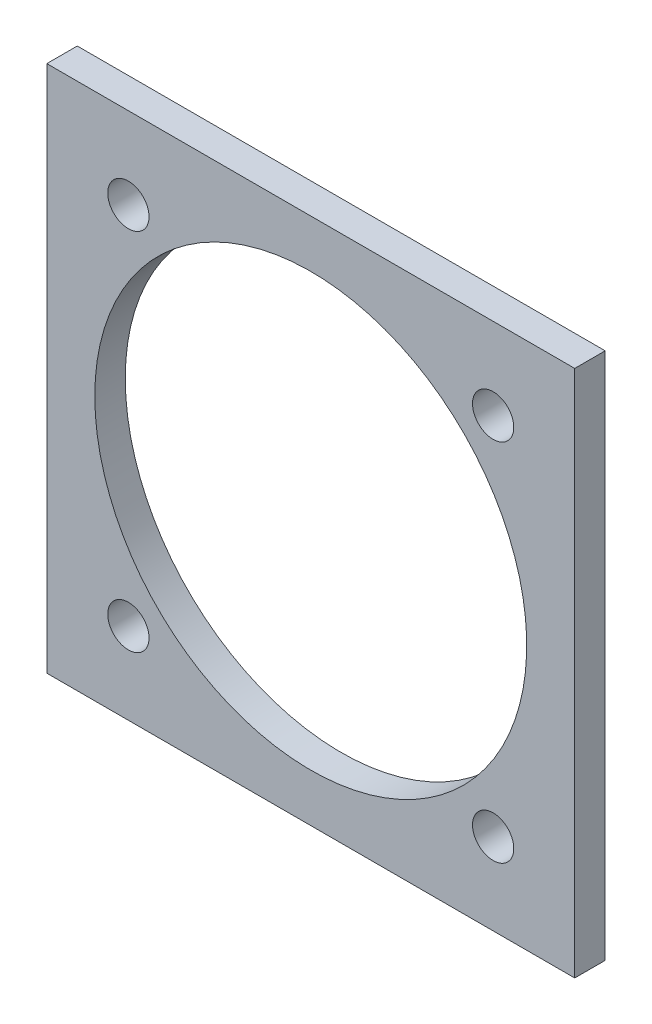
ISO-10303-21;
HEADER;
FILE_DESCRIPTION(('STEP AP214'),'2;1');
FILE_NAME('part.step','',(''),(''),'','','');
FILE_SCHEMA(('AUTOMOTIVE_DESIGN { 1 0 10303 214 1 1 1 1 }'));
ENDSEC;
DATA;
#1=APPLICATION_CONTEXT('core data for automotive mechanical design processes');
#2=APPLICATION_PROTOCOL_DEFINITION('international standard','automotive_design',2000,#1);
#3=PRODUCT_CONTEXT('',#1,'mechanical');
#4=PRODUCT('Part','Part','',(#3));
#5=PRODUCT_RELATED_PRODUCT_CATEGORY('part','',(#4));
#6=PRODUCT_DEFINITION_FORMATION('','',#4);
#7=PRODUCT_DEFINITION_CONTEXT('part definition',#1,'design');
#8=PRODUCT_DEFINITION('design','',#6,#7);
#9=PRODUCT_DEFINITION_SHAPE('','',#8);
#10=(LENGTH_UNIT() NAMED_UNIT(*) SI_UNIT(.MILLI.,.METRE.));
#11=(NAMED_UNIT(*) PLANE_ANGLE_UNIT() SI_UNIT($,.RADIAN.));
#12=(NAMED_UNIT(*) SI_UNIT($,.STERADIAN.) SOLID_ANGLE_UNIT());
#13=UNCERTAINTY_MEASURE_WITH_UNIT(LENGTH_MEASURE(1.E-05),#10,'distance_accuracy_value','');
#14=(GEOMETRIC_REPRESENTATION_CONTEXT(3) GLOBAL_UNCERTAINTY_ASSIGNED_CONTEXT((#13)) GLOBAL_UNIT_ASSIGNED_CONTEXT((#10,
#11,#12)) REPRESENTATION_CONTEXT('',''));
#15=CARTESIAN_POINT('',(0.,0.,0.));
#16=DIRECTION('',(0.,0.,1.));
#17=DIRECTION('',(1.,0.,0.));
#18=AXIS2_PLACEMENT_3D('',#15,#16,#17);
#19=CARTESIAN_POINT('',(-27.5,27.5,3.17500000000001));
#20=DIRECTION('',(0.,0.,0.99999999999999));
#21=DIRECTION('',(1.,0.,0.));
#22=AXIS2_PLACEMENT_3D('',#19,#20,#21);
#23=PLANE('',#22);
#24=CARTESIAN_POINT('',(-19.,-19.,3.17500000000001));
#25=DIRECTION('',(0.,0.,0.99999999999999));
#26=DIRECTION('',(1.,0.,0.));
#27=AXIS2_PLACEMENT_3D('',#24,#25,#26);
#28=CIRCLE('',#27,2.15);
#29=CARTESIAN_POINT('',(-21.15,-19.,3.17500000000001));
#30=VERTEX_POINT('',#29);
#31=EDGE_CURVE('E126',#30,#30,#28,.T.);
#32=ORIENTED_EDGE('',*,*,#31,.F.);
#33=EDGE_LOOP('',(#32));
#34=FACE_BOUND('',#33,.T.);
#35=CARTESIAN_POINT('',(19.0000000000006,19.,3.17500000000001));
#36=DIRECTION('',(0.,0.,0.99999999999999));
#37=DIRECTION('',(1.,0.,0.));
#38=AXIS2_PLACEMENT_3D('',#35,#36,#37);
#39=CIRCLE('',#38,2.15);
#40=CARTESIAN_POINT('',(16.8500000000006,19.,3.17500000000001));
#41=VERTEX_POINT('',#40);
#42=EDGE_CURVE('E114',#41,#41,#39,.T.);
#43=ORIENTED_EDGE('',*,*,#42,.F.);
#44=EDGE_LOOP('',(#43));
#45=FACE_BOUND('',#44,.T.);
#46=DIRECTION('',(0.,-1.,0.));
#47=VECTOR('',#46,1.);
#48=CARTESIAN_POINT('',(-27.5,-27.5,3.17500000000001));
#49=LINE('',#48,#47);
#50=CARTESIAN_POINT('',(-27.5,27.5,3.17500000000001));
#51=VERTEX_POINT('',#50);
#52=CARTESIAN_POINT('',(-27.5,-27.5,3.17500000000001));
#53=VERTEX_POINT('',#52);
#54=EDGE_CURVE('E84',#51,#53,#49,.T.);
#55=ORIENTED_EDGE('',*,*,#54,.T.);
#56=DIRECTION('',(1.,0.,0.));
#57=VECTOR('',#56,1.);
#58=CARTESIAN_POINT('',(27.5,-27.5,3.17500000000001));
#59=LINE('',#58,#57);
#60=CARTESIAN_POINT('',(27.5,-27.5,3.17500000000001));
#61=VERTEX_POINT('',#60);
#62=EDGE_CURVE('E79',#53,#61,#59,.T.);
#63=ORIENTED_EDGE('',*,*,#62,.T.);
#64=DIRECTION('',(0.,1.,0.));
#65=VECTOR('',#64,1.);
#66=CARTESIAN_POINT('',(27.5,-27.5,3.17500000000001));
#67=LINE('',#66,#65);
#68=CARTESIAN_POINT('',(27.5000000000006,27.5,3.17500000000001));
#69=VERTEX_POINT('',#68);
#70=EDGE_CURVE('E82',#61,#69,#67,.T.);
#71=ORIENTED_EDGE('',*,*,#70,.T.);
#72=DIRECTION('',(-1.,0.,0.));
#73=VECTOR('',#72,1.);
#74=CARTESIAN_POINT('',(27.5000000000006,27.5,3.17500000000001));
#75=LINE('',#74,#73);
#76=EDGE_CURVE('E49',#69,#51,#75,.T.);
#77=ORIENTED_EDGE('',*,*,#76,.T.);
#78=EDGE_LOOP('',(#55,#63,#71,#77));
#79=FACE_BOUND('',#78,.T.);
#80=CARTESIAN_POINT('',(0.,0.,3.17500000000001));
#81=DIRECTION('',(0.,0.,0.99999999999999));
#82=DIRECTION('',(1.,0.,0.));
#83=AXIS2_PLACEMENT_3D('',#80,#81,#82);
#84=CIRCLE('',#83,22.5);
#85=CARTESIAN_POINT('',(-22.5,0.,3.17500000000001));
#86=VERTEX_POINT('',#85);
#87=EDGE_CURVE('E99',#86,#86,#84,.T.);
#88=ORIENTED_EDGE('',*,*,#87,.F.);
#89=EDGE_LOOP('',(#88));
#90=FACE_BOUND('',#89,.T.);
#91=CARTESIAN_POINT('',(19.0000000000006,-19.,3.17500000000001));
#92=DIRECTION('',(0.,0.,0.99999999999999));
#93=DIRECTION('',(-1.,0.,0.));
#94=AXIS2_PLACEMENT_3D('',#91,#92,#93);
#95=CIRCLE('',#94,2.15);
#96=CARTESIAN_POINT('',(16.8500000000006,-19.,3.17500000000001));
#97=VERTEX_POINT('',#96);
#98=EDGE_CURVE('E120',#97,#97,#95,.T.);
#99=ORIENTED_EDGE('',*,*,#98,.F.);
#100=EDGE_LOOP('',(#99));
#101=FACE_BOUND('',#100,.T.);
#102=CARTESIAN_POINT('',(-19.,19.,3.17500000000001));
#103=DIRECTION('',(0.,0.,0.99999999999999));
#104=DIRECTION('',(-1.,0.,0.));
#105=AXIS2_PLACEMENT_3D('',#102,#103,#104);
#106=CIRCLE('',#105,2.15);
#107=CARTESIAN_POINT('',(-21.15,19.,3.17500000000001));
#108=VERTEX_POINT('',#107);
#109=EDGE_CURVE('E132',#108,#108,#106,.T.);
#110=ORIENTED_EDGE('',*,*,#109,.F.);
#111=EDGE_LOOP('',(#110));
#112=FACE_BOUND('',#111,.T.);
#113=ADVANCED_FACE('F32',(#34,#45,#79,#90,#101,#112),#23,.T.);
#114=CARTESIAN_POINT('',(-27.5,27.5,0.));
#115=DIRECTION('',(0.,0.,0.99999999999999));
#116=DIRECTION('',(1.,0.,0.));
#117=AXIS2_PLACEMENT_3D('',#114,#115,#116);
#118=PLANE('',#117);
#119=CARTESIAN_POINT('',(-19.,-19.,0.));
#120=DIRECTION('',(0.,0.,0.99999999999999));
#121=DIRECTION('',(1.,0.,0.));
#122=AXIS2_PLACEMENT_3D('',#119,#120,#121);
#123=CIRCLE('',#122,2.15);
#124=CARTESIAN_POINT('',(-21.15,-19.,0.));
#125=VERTEX_POINT('',#124);
#126=EDGE_CURVE('E129',#125,#125,#123,.T.);
#127=ORIENTED_EDGE('',*,*,#126,.T.);
#128=EDGE_LOOP('',(#127));
#129=FACE_BOUND('',#128,.T.);
#130=CARTESIAN_POINT('',(19.0000000000006,19.,0.));
#131=DIRECTION('',(0.,0.,0.99999999999999));
#132=DIRECTION('',(1.,0.,0.));
#133=AXIS2_PLACEMENT_3D('',#130,#131,#132);
#134=CIRCLE('',#133,2.15);
#135=CARTESIAN_POINT('',(16.8500000000006,19.,0.));
#136=VERTEX_POINT('',#135);
#137=EDGE_CURVE('E117',#136,#136,#134,.T.);
#138=ORIENTED_EDGE('',*,*,#137,.T.);
#139=EDGE_LOOP('',(#138));
#140=FACE_BOUND('',#139,.T.);
#141=DIRECTION('',(0.,-1.,0.));
#142=VECTOR('',#141,1.);
#143=CARTESIAN_POINT('',(-27.5,-27.5,0.));
#144=LINE('',#143,#142);
#145=CARTESIAN_POINT('',(-27.5,27.5,0.));
#146=VERTEX_POINT('',#145);
#147=CARTESIAN_POINT('',(-27.5,-27.5,0.));
#148=VERTEX_POINT('',#147);
#149=EDGE_CURVE('E96',#146,#148,#144,.T.);
#150=ORIENTED_EDGE('',*,*,#149,.F.);
#151=DIRECTION('',(-1.,0.,0.));
#152=VECTOR('',#151,1.);
#153=CARTESIAN_POINT('',(27.5000000000006,27.5,0.));
#154=LINE('',#153,#152);
#155=CARTESIAN_POINT('',(27.5000000000006,27.5,0.));
#156=VERTEX_POINT('',#155);
#157=EDGE_CURVE('E72',#156,#146,#154,.T.);
#158=ORIENTED_EDGE('',*,*,#157,.F.);
#159=DIRECTION('',(0.,1.,0.));
#160=VECTOR('',#159,1.);
#161=CARTESIAN_POINT('',(27.5,-27.5,0.));
#162=LINE('',#161,#160);
#163=CARTESIAN_POINT('',(27.5,-27.5,0.));
#164=VERTEX_POINT('',#163);
#165=EDGE_CURVE('E66',#164,#156,#162,.T.);
#166=ORIENTED_EDGE('',*,*,#165,.F.);
#167=DIRECTION('',(1.,0.,0.));
#168=VECTOR('',#167,1.);
#169=CARTESIAN_POINT('',(27.5,-27.5,0.));
#170=LINE('',#169,#168);
#171=EDGE_CURVE('E88',#148,#164,#170,.T.);
#172=ORIENTED_EDGE('',*,*,#171,.F.);
#173=EDGE_LOOP('',(#150,#158,#166,#172));
#174=FACE_BOUND('',#173,.T.);
#175=CARTESIAN_POINT('',(0.,0.,0.));
#176=DIRECTION('',(0.,0.,0.99999999999999));
#177=DIRECTION('',(1.,0.,0.));
#178=AXIS2_PLACEMENT_3D('',#175,#176,#177);
#179=CIRCLE('',#178,22.5);
#180=CARTESIAN_POINT('',(-22.5,0.,0.));
#181=VERTEX_POINT('',#180);
#182=EDGE_CURVE('E111',#181,#181,#179,.T.);
#183=ORIENTED_EDGE('',*,*,#182,.T.);
#184=EDGE_LOOP('',(#183));
#185=FACE_BOUND('',#184,.T.);
#186=CARTESIAN_POINT('',(19.0000000000006,-19.,0.));
#187=DIRECTION('',(0.,0.,0.99999999999999));
#188=DIRECTION('',(-1.,0.,0.));
#189=AXIS2_PLACEMENT_3D('',#186,#187,#188);
#190=CIRCLE('',#189,2.15);
#191=CARTESIAN_POINT('',(16.8500000000006,-19.,0.));
#192=VERTEX_POINT('',#191);
#193=EDGE_CURVE('E123',#192,#192,#190,.T.);
#194=ORIENTED_EDGE('',*,*,#193,.T.);
#195=EDGE_LOOP('',(#194));
#196=FACE_BOUND('',#195,.T.);
#197=CARTESIAN_POINT('',(-19.,19.,0.));
#198=DIRECTION('',(0.,0.,0.99999999999999));
#199=DIRECTION('',(-1.,0.,0.));
#200=AXIS2_PLACEMENT_3D('',#197,#198,#199);
#201=CIRCLE('',#200,2.15);
#202=CARTESIAN_POINT('',(-21.15,19.,0.));
#203=VERTEX_POINT('',#202);
#204=EDGE_CURVE('E135',#203,#203,#201,.T.);
#205=ORIENTED_EDGE('',*,*,#204,.T.);
#206=EDGE_LOOP('',(#205));
#207=FACE_BOUND('',#206,.T.);
#208=ADVANCED_FACE('F107',(#129,#140,#174,#185,#196,#207),#118,.F.);
#209=CARTESIAN_POINT('',(-27.5,-27.5,3.17500000000001));
#210=DIRECTION('',(1.,0.,0.));
#211=DIRECTION('',(0.,0.,-0.99999999999999));
#212=AXIS2_PLACEMENT_3D('',#209,#210,#211);
#213=PLANE('',#212);
#214=ORIENTED_EDGE('',*,*,#149,.T.);
#215=DIRECTION('',(0.,0.,-0.99999999999999));
#216=VECTOR('',#215,1.);
#217=CARTESIAN_POINT('',(-27.5,-27.5,3.17500000000001));
#218=LINE('',#217,#216);
#219=EDGE_CURVE('E11',#53,#148,#218,.T.);
#220=ORIENTED_EDGE('',*,*,#219,.F.);
#221=ORIENTED_EDGE('',*,*,#54,.F.);
#222=DIRECTION('',(0.,0.,-0.99999999999999));
#223=VECTOR('',#222,1.);
#224=CARTESIAN_POINT('',(-27.5,27.5,3.17500000000001));
#225=LINE('',#224,#223);
#226=EDGE_CURVE('E92',#51,#146,#225,.T.);
#227=ORIENTED_EDGE('',*,*,#226,.T.);
#228=EDGE_LOOP('',(#214,#220,#221,#227));
#229=FACE_BOUND('',#228,.T.);
#230=ADVANCED_FACE('F34',(#229),#213,.F.);
#231=CARTESIAN_POINT('',(27.5,-27.5,3.17500000000001));
#232=DIRECTION('',(0.,1.,0.));
#233=DIRECTION('',(0.,0.,0.99999999999999));
#234=AXIS2_PLACEMENT_3D('',#231,#232,#233);
#235=PLANE('',#234);
#236=ORIENTED_EDGE('',*,*,#171,.T.);
#237=DIRECTION('',(0.,0.,-0.99999999999999));
#238=VECTOR('',#237,1.);
#239=CARTESIAN_POINT('',(27.5,-27.5,3.17500000000001));
#240=LINE('',#239,#238);
#241=EDGE_CURVE('E41',#61,#164,#240,.T.);
#242=ORIENTED_EDGE('',*,*,#241,.F.);
#243=ORIENTED_EDGE('',*,*,#62,.F.);
#244=ORIENTED_EDGE('',*,*,#219,.T.);
#245=EDGE_LOOP('',(#236,#242,#243,#244));
#246=FACE_BOUND('',#245,.T.);
#247=ADVANCED_FACE('F87',(#246),#235,.F.);
#248=CARTESIAN_POINT('',(27.5,-27.5,3.17500000000001));
#249=DIRECTION('',(-1.,0.,0.));
#250=DIRECTION('',(0.,0.,0.99999999999999));
#251=AXIS2_PLACEMENT_3D('',#248,#249,#250);
#252=PLANE('',#251);
#253=ORIENTED_EDGE('',*,*,#165,.T.);
#254=DIRECTION('',(0.,0.,-0.99999999999999));
#255=VECTOR('',#254,1.);
#256=CARTESIAN_POINT('',(27.5000000000006,27.5,3.17500000000001));
#257=LINE('',#256,#255);
#258=EDGE_CURVE('E89',#69,#156,#257,.T.);
#259=ORIENTED_EDGE('',*,*,#258,.F.);
#260=ORIENTED_EDGE('',*,*,#70,.F.);
#261=ORIENTED_EDGE('',*,*,#241,.T.);
#262=EDGE_LOOP('',(#253,#259,#260,#261));
#263=FACE_BOUND('',#262,.T.);
#264=ADVANCED_FACE('F90',(#263),#252,.F.);
#265=CARTESIAN_POINT('',(27.5000000000006,27.5,3.17500000000001));
#266=DIRECTION('',(0.,-1.,0.));
#267=DIRECTION('',(0.,0.,-0.99999999999999));
#268=AXIS2_PLACEMENT_3D('',#265,#266,#267);
#269=PLANE('',#268);
#270=ORIENTED_EDGE('',*,*,#157,.T.);
#271=ORIENTED_EDGE('',*,*,#226,.F.);
#272=ORIENTED_EDGE('',*,*,#76,.F.);
#273=ORIENTED_EDGE('',*,*,#258,.T.);
#274=EDGE_LOOP('',(#270,#271,#272,#273));
#275=FACE_BOUND('',#274,.T.);
#276=ADVANCED_FACE('F104',(#275),#269,.F.);
#277=CARTESIAN_POINT('',(0.,0.,3.17500000000001));
#278=DIRECTION('',(0.,0.,-0.99999999999999));
#279=DIRECTION('',(-1.,0.,0.));
#280=AXIS2_PLACEMENT_3D('',#277,#278,#279);
#281=CYLINDRICAL_SURFACE('',#280,22.5);
#282=CARTESIAN_POINT('',(-22.5,0.,3.17500000000001));
#283=CARTESIAN_POINT('',(-22.5,0.,3.14192708333334));
#284=CARTESIAN_POINT('',(-22.5,0.,3.10885416666668));
#285=CARTESIAN_POINT('',(-22.5,0.,3.04270833333334));
#286=CARTESIAN_POINT('',(-22.5,0.,3.00963541666668));
#287=CARTESIAN_POINT('',(-22.5,0.,2.94348958333334));
#288=CARTESIAN_POINT('',(-22.5,0.,2.91041666666668));
#289=CARTESIAN_POINT('',(-22.5,0.,2.84427083333334));
#290=CARTESIAN_POINT('',(-22.5,0.,2.81119791666668));
#291=CARTESIAN_POINT('',(-22.5,0.,2.74505208333334));
#292=CARTESIAN_POINT('',(-22.5,0.,2.71197916666668));
#293=CARTESIAN_POINT('',(-22.5,0.,2.64583333333334));
#294=CARTESIAN_POINT('',(-22.5,0.,2.61276041666668));
#295=CARTESIAN_POINT('',(-22.5,0.,2.54661458333334));
#296=CARTESIAN_POINT('',(-22.5,0.,2.51354166666668));
#297=CARTESIAN_POINT('',(-22.5,0.,2.44739583333334));
#298=CARTESIAN_POINT('',(-22.5,0.,2.41432291666667));
#299=CARTESIAN_POINT('',(-22.5,0.,2.34817708333334));
#300=CARTESIAN_POINT('',(-22.5,0.,2.31510416666667));
#301=CARTESIAN_POINT('',(-22.5,0.,2.24895833333334));
#302=CARTESIAN_POINT('',(-22.5,0.,2.21588541666667));
#303=CARTESIAN_POINT('',(-22.5,0.,2.14973958333334));
#304=CARTESIAN_POINT('',(-22.5,0.,2.11666666666667));
#305=CARTESIAN_POINT('',(-22.5,0.,2.05052083333334));
#306=CARTESIAN_POINT('',(-22.5,0.,2.01744791666667));
#307=CARTESIAN_POINT('',(-22.5,0.,1.95130208333334));
#308=CARTESIAN_POINT('',(-22.5,0.,1.91822916666667));
#309=CARTESIAN_POINT('',(-22.5,0.,1.85208333333334));
#310=CARTESIAN_POINT('',(-22.5,0.,1.81901041666667));
#311=CARTESIAN_POINT('',(-22.5,0.,1.75286458333334));
#312=CARTESIAN_POINT('',(-22.5,0.,1.71979166666667));
#313=CARTESIAN_POINT('',(-22.5,0.,1.65364583333334));
#314=CARTESIAN_POINT('',(-22.5,0.,1.62057291666667));
#315=CARTESIAN_POINT('',(-22.5,0.,1.55442708333334));
#316=CARTESIAN_POINT('',(-22.5,0.,1.52135416666667));
#317=CARTESIAN_POINT('',(-22.5,0.,1.45520833333334));
#318=CARTESIAN_POINT('',(-22.5,0.,1.42213541666667));
#319=CARTESIAN_POINT('',(-22.5,0.,1.35598958333334));
#320=CARTESIAN_POINT('',(-22.5,0.,1.32291666666667));
#321=CARTESIAN_POINT('',(-22.5,0.,1.25677083333334));
#322=CARTESIAN_POINT('',(-22.5,0.,1.22369791666667));
#323=CARTESIAN_POINT('',(-22.5,0.,1.15755208333334));
#324=CARTESIAN_POINT('',(-22.5,0.,1.12447916666667));
#325=CARTESIAN_POINT('',(-22.5,0.,1.05833333333334));
#326=CARTESIAN_POINT('',(-22.5,0.,1.02526041666667));
#327=CARTESIAN_POINT('',(-22.5,0.,0.959114583333336));
#328=CARTESIAN_POINT('',(-22.5,0.,0.92604166666667));
#329=CARTESIAN_POINT('',(-22.5,0.,0.859895833333336));
#330=CARTESIAN_POINT('',(-22.5,0.,0.826822916666669));
#331=CARTESIAN_POINT('',(-22.5,0.,0.760677083333336));
#332=CARTESIAN_POINT('',(-22.5,0.,0.727604166666669));
#333=CARTESIAN_POINT('',(-22.5,0.,0.661458333333335));
#334=CARTESIAN_POINT('',(-22.5,0.,0.628385416666668));
#335=CARTESIAN_POINT('',(-22.5,0.,0.562239583333335));
#336=CARTESIAN_POINT('',(-22.5,0.,0.529166666666668));
#337=CARTESIAN_POINT('',(-22.5,0.,0.463020833333335));
#338=CARTESIAN_POINT('',(-22.5,0.,0.429947916666668));
#339=CARTESIAN_POINT('',(-22.5,0.,0.363802083333334));
#340=CARTESIAN_POINT('',(-22.5,0.,0.330729166666667));
#341=CARTESIAN_POINT('',(-22.5,0.,0.264583333333334));
#342=CARTESIAN_POINT('',(-22.5,0.,0.231510416666667));
#343=CARTESIAN_POINT('',(-22.5,0.,0.165364583333333));
#344=CARTESIAN_POINT('',(-22.5,0.,0.132291666666666));
#345=CARTESIAN_POINT('',(-22.5,0.,0.0661458333333328));
#346=CARTESIAN_POINT('',(-22.5,0.,0.0330729166666662));
#347=CARTESIAN_POINT('',(-22.5,0.,0.));
#348=B_SPLINE_CURVE_WITH_KNOTS('',3,(#282,#283,#284,#285,#286,#287,#288,#289,#290,#291,#292,
#293,#294,#295,#296,#297,#298,#299,#300,#301,#302,#303,#304,#305,#306,#307,#308,#309,#310,#311,
#312,#313,#314,#315,#316,#317,#318,#319,#320,#321,#322,#323,#324,#325,#326,#327,#328,#329,#330,
#331,#332,#333,#334,#335,#336,#337,#338,#339,#340,#341,#342,#343,#344,#345,#346,#347),
.UNSPECIFIED.,.F.,.F.,(4,2,2,2,2,2,2,2,2,2,2,2,2,2,2,2,2,2,2,2,2,2,2,2,2,2,2,2,2,2,2,2,4),(0.,
0.0992187500000008,0.198437500000001,0.297656250000001,0.396875000000002,0.496093750000002,
0.595312500000003,0.694531250000003,0.793750000000003,0.892968750000004,0.992187500000004,
1.09140625,1.190625,1.28984375000001,1.38906250000001,1.48828125000001,1.58750000000001,
1.68671875000001,1.78593750000001,1.88515625000001,1.98437500000001,2.08359375000001,
2.18281250000001,2.28203125000001,2.38125000000001,2.48046875000001,2.57968750000001,
2.67890625000001,2.77812500000001,2.87734375000001,2.97656250000001,3.07578125000001,
3.17500000000001),.UNSPECIFIED.);
#349=EDGE_CURVE('BSEAM155',#86,#181,#348,.T.);
#350=ORIENTED_EDGE('',*,*,#87,.T.);
#351=ORIENTED_EDGE('',*,*,#182,.F.);
#352=ORIENTED_EDGE('',*,*,#349,.T.);
#353=ORIENTED_EDGE('',*,*,#349,.F.);
#354=EDGE_LOOP('',(#350,#352,#351,#353));
#355=FACE_BOUND('',#354,.T.);
#356=ADVANCED_FACE('F155',(#355),#281,.F.);
#357=CARTESIAN_POINT('',(19.0000000000006,19.,3.17500000000001));
#358=DIRECTION('',(0.,0.,-0.99999999999999));
#359=DIRECTION('',(-1.,0.,0.));
#360=AXIS2_PLACEMENT_3D('',#357,#358,#359);
#361=CYLINDRICAL_SURFACE('',#360,2.15);
#362=CARTESIAN_POINT('',(16.8500000000006,19.,3.17500000000001));
#363=CARTESIAN_POINT('',(16.8500000000006,19.,3.14192708333334));
#364=CARTESIAN_POINT('',(16.8500000000006,19.,3.10885416666668));
#365=CARTESIAN_POINT('',(16.8500000000006,19.,3.04270833333334));
#366=CARTESIAN_POINT('',(16.8500000000006,19.,3.00963541666668));
#367=CARTESIAN_POINT('',(16.8500000000006,19.,2.94348958333334));
#368=CARTESIAN_POINT('',(16.8500000000006,19.,2.91041666666668));
#369=CARTESIAN_POINT('',(16.8500000000006,19.,2.84427083333334));
#370=CARTESIAN_POINT('',(16.8500000000006,19.,2.81119791666668));
#371=CARTESIAN_POINT('',(16.8500000000006,19.,2.74505208333334));
#372=CARTESIAN_POINT('',(16.8500000000006,19.,2.71197916666668));
#373=CARTESIAN_POINT('',(16.8500000000006,19.,2.64583333333334));
#374=CARTESIAN_POINT('',(16.8500000000006,19.,2.61276041666668));
#375=CARTESIAN_POINT('',(16.8500000000006,19.,2.54661458333334));
#376=CARTESIAN_POINT('',(16.8500000000006,19.,2.51354166666668));
#377=CARTESIAN_POINT('',(16.8500000000006,19.,2.44739583333334));
#378=CARTESIAN_POINT('',(16.8500000000006,19.,2.41432291666667));
#379=CARTESIAN_POINT('',(16.8500000000006,19.,2.34817708333334));
#380=CARTESIAN_POINT('',(16.8500000000006,19.,2.31510416666667));
#381=CARTESIAN_POINT('',(16.8500000000006,19.,2.24895833333334));
#382=CARTESIAN_POINT('',(16.8500000000006,19.,2.21588541666667));
#383=CARTESIAN_POINT('',(16.8500000000006,19.,2.14973958333334));
#384=CARTESIAN_POINT('',(16.8500000000006,19.,2.11666666666667));
#385=CARTESIAN_POINT('',(16.8500000000006,19.,2.05052083333334));
#386=CARTESIAN_POINT('',(16.8500000000006,19.,2.01744791666667));
#387=CARTESIAN_POINT('',(16.8500000000006,19.,1.95130208333334));
#388=CARTESIAN_POINT('',(16.8500000000006,19.,1.91822916666667));
#389=CARTESIAN_POINT('',(16.8500000000006,19.,1.85208333333334));
#390=CARTESIAN_POINT('',(16.8500000000006,19.,1.81901041666667));
#391=CARTESIAN_POINT('',(16.8500000000006,19.,1.75286458333334));
#392=CARTESIAN_POINT('',(16.8500000000006,19.,1.71979166666667));
#393=CARTESIAN_POINT('',(16.8500000000006,19.,1.65364583333334));
#394=CARTESIAN_POINT('',(16.8500000000006,19.,1.62057291666667));
#395=CARTESIAN_POINT('',(16.8500000000006,19.,1.55442708333334));
#396=CARTESIAN_POINT('',(16.8500000000006,19.,1.52135416666667));
#397=CARTESIAN_POINT('',(16.8500000000006,19.,1.45520833333334));
#398=CARTESIAN_POINT('',(16.8500000000006,19.,1.42213541666667));
#399=CARTESIAN_POINT('',(16.8500000000006,19.,1.35598958333334));
#400=CARTESIAN_POINT('',(16.8500000000006,19.,1.32291666666667));
#401=CARTESIAN_POINT('',(16.8500000000006,19.,1.25677083333334));
#402=CARTESIAN_POINT('',(16.8500000000006,19.,1.22369791666667));
#403=CARTESIAN_POINT('',(16.8500000000006,19.,1.15755208333334));
#404=CARTESIAN_POINT('',(16.8500000000006,19.,1.12447916666667));
#405=CARTESIAN_POINT('',(16.8500000000006,19.,1.05833333333334));
#406=CARTESIAN_POINT('',(16.8500000000006,19.,1.02526041666667));
#407=CARTESIAN_POINT('',(16.8500000000006,19.,0.959114583333336));
#408=CARTESIAN_POINT('',(16.8500000000006,19.,0.92604166666667));
#409=CARTESIAN_POINT('',(16.8500000000006,19.,0.859895833333336));
#410=CARTESIAN_POINT('',(16.8500000000006,19.,0.826822916666669));
#411=CARTESIAN_POINT('',(16.8500000000006,19.,0.760677083333336));
#412=CARTESIAN_POINT('',(16.8500000000006,19.,0.727604166666669));
#413=CARTESIAN_POINT('',(16.8500000000006,19.,0.661458333333335));
#414=CARTESIAN_POINT('',(16.8500000000006,19.,0.628385416666668));
#415=CARTESIAN_POINT('',(16.8500000000006,19.,0.562239583333335));
#416=CARTESIAN_POINT('',(16.8500000000006,19.,0.529166666666668));
#417=CARTESIAN_POINT('',(16.8500000000006,19.,0.463020833333335));
#418=CARTESIAN_POINT('',(16.8500000000006,19.,0.429947916666668));
#419=CARTESIAN_POINT('',(16.8500000000006,19.,0.363802083333334));
#420=CARTESIAN_POINT('',(16.8500000000006,19.,0.330729166666667));
#421=CARTESIAN_POINT('',(16.8500000000006,19.,0.264583333333334));
#422=CARTESIAN_POINT('',(16.8500000000006,19.,0.231510416666667));
#423=CARTESIAN_POINT('',(16.8500000000006,19.,0.165364583333333));
#424=CARTESIAN_POINT('',(16.8500000000006,19.,0.132291666666666));
#425=CARTESIAN_POINT('',(16.8500000000006,19.,0.0661458333333328));
#426=CARTESIAN_POINT('',(16.8500000000006,19.,0.0330729166666662));
#427=CARTESIAN_POINT('',(16.8500000000006,19.,0.));
#428=B_SPLINE_CURVE_WITH_KNOTS('',3,(#362,#363,#364,#365,#366,#367,#368,#369,#370,#371,#372,
#373,#374,#375,#376,#377,#378,#379,#380,#381,#382,#383,#384,#385,#386,#387,#388,#389,#390,#391,
#392,#393,#394,#395,#396,#397,#398,#399,#400,#401,#402,#403,#404,#405,#406,#407,#408,#409,#410,
#411,#412,#413,#414,#415,#416,#417,#418,#419,#420,#421,#422,#423,#424,#425,#426,#427),
.UNSPECIFIED.,.F.,.F.,(4,2,2,2,2,2,2,2,2,2,2,2,2,2,2,2,2,2,2,2,2,2,2,2,2,2,2,2,2,2,2,2,4),(0.,
0.0992187500000008,0.198437500000001,0.297656250000001,0.396875000000002,0.496093750000002,
0.595312500000003,0.694531250000003,0.793750000000003,0.892968750000004,0.992187500000004,
1.09140625,1.190625,1.28984375000001,1.38906250000001,1.48828125000001,1.58750000000001,
1.68671875000001,1.78593750000001,1.88515625000001,1.98437500000001,2.08359375000001,
2.18281250000001,2.28203125000001,2.38125000000001,2.48046875000001,2.57968750000001,
2.67890625000001,2.77812500000001,2.87734375000001,2.97656250000001,3.07578125000001,
3.17500000000001),.UNSPECIFIED.);
#429=EDGE_CURVE('BSEAM201',#41,#136,#428,.T.);
#430=ORIENTED_EDGE('',*,*,#42,.T.);
#431=ORIENTED_EDGE('',*,*,#137,.F.);
#432=ORIENTED_EDGE('',*,*,#429,.T.);
#433=ORIENTED_EDGE('',*,*,#429,.F.);
#434=EDGE_LOOP('',(#430,#432,#431,#433));
#435=FACE_BOUND('',#434,.T.);
#436=ADVANCED_FACE('F201',(#435),#361,.F.);
#437=CARTESIAN_POINT('',(19.0000000000006,-19.,3.17500000000001));
#438=DIRECTION('',(0.,0.,-0.99999999999999));
#439=DIRECTION('',(-1.,0.,0.));
#440=AXIS2_PLACEMENT_3D('',#437,#438,#439);
#441=CYLINDRICAL_SURFACE('',#440,2.15);
#442=CARTESIAN_POINT('',(16.8500000000006,-19.,3.17500000000001));
#443=CARTESIAN_POINT('',(16.8500000000006,-19.,3.14192708333334));
#444=CARTESIAN_POINT('',(16.8500000000006,-19.,3.10885416666668));
#445=CARTESIAN_POINT('',(16.8500000000006,-19.,3.04270833333334));
#446=CARTESIAN_POINT('',(16.8500000000006,-19.,3.00963541666668));
#447=CARTESIAN_POINT('',(16.8500000000006,-19.,2.94348958333334));
#448=CARTESIAN_POINT('',(16.8500000000006,-19.,2.91041666666668));
#449=CARTESIAN_POINT('',(16.8500000000006,-19.,2.84427083333334));
#450=CARTESIAN_POINT('',(16.8500000000006,-19.,2.81119791666668));
#451=CARTESIAN_POINT('',(16.8500000000006,-19.,2.74505208333334));
#452=CARTESIAN_POINT('',(16.8500000000006,-19.,2.71197916666668));
#453=CARTESIAN_POINT('',(16.8500000000006,-19.,2.64583333333334));
#454=CARTESIAN_POINT('',(16.8500000000006,-19.,2.61276041666668));
#455=CARTESIAN_POINT('',(16.8500000000006,-19.,2.54661458333334));
#456=CARTESIAN_POINT('',(16.8500000000006,-19.,2.51354166666668));
#457=CARTESIAN_POINT('',(16.8500000000006,-19.,2.44739583333334));
#458=CARTESIAN_POINT('',(16.8500000000006,-19.,2.41432291666667));
#459=CARTESIAN_POINT('',(16.8500000000006,-19.,2.34817708333334));
#460=CARTESIAN_POINT('',(16.8500000000006,-19.,2.31510416666667));
#461=CARTESIAN_POINT('',(16.8500000000006,-19.,2.24895833333334));
#462=CARTESIAN_POINT('',(16.8500000000006,-19.,2.21588541666667));
#463=CARTESIAN_POINT('',(16.8500000000006,-19.,2.14973958333334));
#464=CARTESIAN_POINT('',(16.8500000000006,-19.,2.11666666666667));
#465=CARTESIAN_POINT('',(16.8500000000006,-19.,2.05052083333334));
#466=CARTESIAN_POINT('',(16.8500000000006,-19.,2.01744791666667));
#467=CARTESIAN_POINT('',(16.8500000000006,-19.,1.95130208333334));
#468=CARTESIAN_POINT('',(16.8500000000006,-19.,1.91822916666667));
#469=CARTESIAN_POINT('',(16.8500000000006,-19.,1.85208333333334));
#470=CARTESIAN_POINT('',(16.8500000000006,-19.,1.81901041666667));
#471=CARTESIAN_POINT('',(16.8500000000006,-19.,1.75286458333334));
#472=CARTESIAN_POINT('',(16.8500000000006,-19.,1.71979166666667));
#473=CARTESIAN_POINT('',(16.8500000000006,-19.,1.65364583333334));
#474=CARTESIAN_POINT('',(16.8500000000006,-19.,1.62057291666667));
#475=CARTESIAN_POINT('',(16.8500000000006,-19.,1.55442708333334));
#476=CARTESIAN_POINT('',(16.8500000000006,-19.,1.52135416666667));
#477=CARTESIAN_POINT('',(16.8500000000006,-19.,1.45520833333334));
#478=CARTESIAN_POINT('',(16.8500000000006,-19.,1.42213541666667));
#479=CARTESIAN_POINT('',(16.8500000000006,-19.,1.35598958333334));
#480=CARTESIAN_POINT('',(16.8500000000006,-19.,1.32291666666667));
#481=CARTESIAN_POINT('',(16.8500000000006,-19.,1.25677083333334));
#482=CARTESIAN_POINT('',(16.8500000000006,-19.,1.22369791666667));
#483=CARTESIAN_POINT('',(16.8500000000006,-19.,1.15755208333334));
#484=CARTESIAN_POINT('',(16.8500000000006,-19.,1.12447916666667));
#485=CARTESIAN_POINT('',(16.8500000000006,-19.,1.05833333333334));
#486=CARTESIAN_POINT('',(16.8500000000006,-19.,1.02526041666667));
#487=CARTESIAN_POINT('',(16.8500000000006,-19.,0.959114583333336));
#488=CARTESIAN_POINT('',(16.8500000000006,-19.,0.92604166666667));
#489=CARTESIAN_POINT('',(16.8500000000006,-19.,0.859895833333336));
#490=CARTESIAN_POINT('',(16.8500000000006,-19.,0.826822916666669));
#491=CARTESIAN_POINT('',(16.8500000000006,-19.,0.760677083333336));
#492=CARTESIAN_POINT('',(16.8500000000006,-19.,0.727604166666669));
#493=CARTESIAN_POINT('',(16.8500000000006,-19.,0.661458333333335));
#494=CARTESIAN_POINT('',(16.8500000000006,-19.,0.628385416666668));
#495=CARTESIAN_POINT('',(16.8500000000006,-19.,0.562239583333335));
#496=CARTESIAN_POINT('',(16.8500000000006,-19.,0.529166666666668));
#497=CARTESIAN_POINT('',(16.8500000000006,-19.,0.463020833333335));
#498=CARTESIAN_POINT('',(16.8500000000006,-19.,0.429947916666668));
#499=CARTESIAN_POINT('',(16.8500000000006,-19.,0.363802083333334));
#500=CARTESIAN_POINT('',(16.8500000000006,-19.,0.330729166666667));
#501=CARTESIAN_POINT('',(16.8500000000006,-19.,0.264583333333334));
#502=CARTESIAN_POINT('',(16.8500000000006,-19.,0.231510416666667));
#503=CARTESIAN_POINT('',(16.8500000000006,-19.,0.165364583333333));
#504=CARTESIAN_POINT('',(16.8500000000006,-19.,0.132291666666666));
#505=CARTESIAN_POINT('',(16.8500000000006,-19.,0.0661458333333328));
#506=CARTESIAN_POINT('',(16.8500000000006,-19.,0.0330729166666662));
#507=CARTESIAN_POINT('',(16.8500000000006,-19.,0.));
#508=B_SPLINE_CURVE_WITH_KNOTS('',3,(#442,#443,#444,#445,#446,#447,#448,#449,#450,#451,#452,
#453,#454,#455,#456,#457,#458,#459,#460,#461,#462,#463,#464,#465,#466,#467,#468,#469,#470,#471,
#472,#473,#474,#475,#476,#477,#478,#479,#480,#481,#482,#483,#484,#485,#486,#487,#488,#489,#490,
#491,#492,#493,#494,#495,#496,#497,#498,#499,#500,#501,#502,#503,#504,#505,#506,#507),
.UNSPECIFIED.,.F.,.F.,(4,2,2,2,2,2,2,2,2,2,2,2,2,2,2,2,2,2,2,2,2,2,2,2,2,2,2,2,2,2,2,2,4),(0.,
0.0992187500000008,0.198437500000001,0.297656250000001,0.396875000000002,0.496093750000002,
0.595312500000003,0.694531250000003,0.793750000000003,0.892968750000004,0.992187500000004,
1.09140625,1.190625,1.28984375000001,1.38906250000001,1.48828125000001,1.58750000000001,
1.68671875000001,1.78593750000001,1.88515625000001,1.98437500000001,2.08359375000001,
2.18281250000001,2.28203125000001,2.38125000000001,2.48046875000001,2.57968750000001,
2.67890625000001,2.77812500000001,2.87734375000001,2.97656250000001,3.07578125000001,
3.17500000000001),.UNSPECIFIED.);
#509=EDGE_CURVE('BSEAM209',#97,#192,#508,.T.);
#510=ORIENTED_EDGE('',*,*,#98,.T.);
#511=ORIENTED_EDGE('',*,*,#193,.F.);
#512=ORIENTED_EDGE('',*,*,#509,.T.);
#513=ORIENTED_EDGE('',*,*,#509,.F.);
#514=EDGE_LOOP('',(#510,#512,#511,#513));
#515=FACE_BOUND('',#514,.T.);
#516=ADVANCED_FACE('F209',(#515),#441,.F.);
#517=CARTESIAN_POINT('',(-19.,-19.,3.17500000000001));
#518=DIRECTION('',(0.,0.,-0.99999999999999));
#519=DIRECTION('',(-1.,0.,0.));
#520=AXIS2_PLACEMENT_3D('',#517,#518,#519);
#521=CYLINDRICAL_SURFACE('',#520,2.15);
#522=CARTESIAN_POINT('',(-21.15,-19.,3.17500000000001));
#523=CARTESIAN_POINT('',(-21.15,-19.,3.14192708333334));
#524=CARTESIAN_POINT('',(-21.15,-19.,3.10885416666668));
#525=CARTESIAN_POINT('',(-21.15,-19.,3.04270833333334));
#526=CARTESIAN_POINT('',(-21.15,-19.,3.00963541666668));
#527=CARTESIAN_POINT('',(-21.15,-19.,2.94348958333334));
#528=CARTESIAN_POINT('',(-21.15,-19.,2.91041666666668));
#529=CARTESIAN_POINT('',(-21.15,-19.,2.84427083333334));
#530=CARTESIAN_POINT('',(-21.15,-19.,2.81119791666668));
#531=CARTESIAN_POINT('',(-21.15,-19.,2.74505208333334));
#532=CARTESIAN_POINT('',(-21.15,-19.,2.71197916666668));
#533=CARTESIAN_POINT('',(-21.15,-19.,2.64583333333334));
#534=CARTESIAN_POINT('',(-21.15,-19.,2.61276041666668));
#535=CARTESIAN_POINT('',(-21.15,-19.,2.54661458333334));
#536=CARTESIAN_POINT('',(-21.15,-19.,2.51354166666668));
#537=CARTESIAN_POINT('',(-21.15,-19.,2.44739583333334));
#538=CARTESIAN_POINT('',(-21.15,-19.,2.41432291666667));
#539=CARTESIAN_POINT('',(-21.15,-19.,2.34817708333334));
#540=CARTESIAN_POINT('',(-21.15,-19.,2.31510416666667));
#541=CARTESIAN_POINT('',(-21.15,-19.,2.24895833333334));
#542=CARTESIAN_POINT('',(-21.15,-19.,2.21588541666667));
#543=CARTESIAN_POINT('',(-21.15,-19.,2.14973958333334));
#544=CARTESIAN_POINT('',(-21.15,-19.,2.11666666666667));
#545=CARTESIAN_POINT('',(-21.15,-19.,2.05052083333334));
#546=CARTESIAN_POINT('',(-21.15,-19.,2.01744791666667));
#547=CARTESIAN_POINT('',(-21.15,-19.,1.95130208333334));
#548=CARTESIAN_POINT('',(-21.15,-19.,1.91822916666667));
#549=CARTESIAN_POINT('',(-21.15,-19.,1.85208333333334));
#550=CARTESIAN_POINT('',(-21.15,-19.,1.81901041666667));
#551=CARTESIAN_POINT('',(-21.15,-19.,1.75286458333334));
#552=CARTESIAN_POINT('',(-21.15,-19.,1.71979166666667));
#553=CARTESIAN_POINT('',(-21.15,-19.,1.65364583333334));
#554=CARTESIAN_POINT('',(-21.15,-19.,1.62057291666667));
#555=CARTESIAN_POINT('',(-21.15,-19.,1.55442708333334));
#556=CARTESIAN_POINT('',(-21.15,-19.,1.52135416666667));
#557=CARTESIAN_POINT('',(-21.15,-19.,1.45520833333334));
#558=CARTESIAN_POINT('',(-21.15,-19.,1.42213541666667));
#559=CARTESIAN_POINT('',(-21.15,-19.,1.35598958333334));
#560=CARTESIAN_POINT('',(-21.15,-19.,1.32291666666667));
#561=CARTESIAN_POINT('',(-21.15,-19.,1.25677083333334));
#562=CARTESIAN_POINT('',(-21.15,-19.,1.22369791666667));
#563=CARTESIAN_POINT('',(-21.15,-19.,1.15755208333334));
#564=CARTESIAN_POINT('',(-21.15,-19.,1.12447916666667));
#565=CARTESIAN_POINT('',(-21.15,-19.,1.05833333333334));
#566=CARTESIAN_POINT('',(-21.15,-19.,1.02526041666667));
#567=CARTESIAN_POINT('',(-21.15,-19.,0.959114583333336));
#568=CARTESIAN_POINT('',(-21.15,-19.,0.92604166666667));
#569=CARTESIAN_POINT('',(-21.15,-19.,0.859895833333336));
#570=CARTESIAN_POINT('',(-21.15,-19.,0.826822916666669));
#571=CARTESIAN_POINT('',(-21.15,-19.,0.760677083333336));
#572=CARTESIAN_POINT('',(-21.15,-19.,0.727604166666669));
#573=CARTESIAN_POINT('',(-21.15,-19.,0.661458333333335));
#574=CARTESIAN_POINT('',(-21.15,-19.,0.628385416666668));
#575=CARTESIAN_POINT('',(-21.15,-19.,0.562239583333335));
#576=CARTESIAN_POINT('',(-21.15,-19.,0.529166666666668));
#577=CARTESIAN_POINT('',(-21.15,-19.,0.463020833333335));
#578=CARTESIAN_POINT('',(-21.15,-19.,0.429947916666668));
#579=CARTESIAN_POINT('',(-21.15,-19.,0.363802083333334));
#580=CARTESIAN_POINT('',(-21.15,-19.,0.330729166666667));
#581=CARTESIAN_POINT('',(-21.15,-19.,0.264583333333334));
#582=CARTESIAN_POINT('',(-21.15,-19.,0.231510416666667));
#583=CARTESIAN_POINT('',(-21.15,-19.,0.165364583333333));
#584=CARTESIAN_POINT('',(-21.15,-19.,0.132291666666666));
#585=CARTESIAN_POINT('',(-21.15,-19.,0.0661458333333328));
#586=CARTESIAN_POINT('',(-21.15,-19.,0.0330729166666662));
#587=CARTESIAN_POINT('',(-21.15,-19.,0.));
#588=B_SPLINE_CURVE_WITH_KNOTS('',3,(#522,#523,#524,#525,#526,#527,#528,#529,#530,#531,#532,
#533,#534,#535,#536,#537,#538,#539,#540,#541,#542,#543,#544,#545,#546,#547,#548,#549,#550,#551,
#552,#553,#554,#555,#556,#557,#558,#559,#560,#561,#562,#563,#564,#565,#566,#567,#568,#569,#570,
#571,#572,#573,#574,#575,#576,#577,#578,#579,#580,#581,#582,#583,#584,#585,#586,#587),
.UNSPECIFIED.,.F.,.F.,(4,2,2,2,2,2,2,2,2,2,2,2,2,2,2,2,2,2,2,2,2,2,2,2,2,2,2,2,2,2,2,2,4),(0.,
0.0992187500000008,0.198437500000001,0.297656250000001,0.396875000000002,0.496093750000002,
0.595312500000003,0.694531250000003,0.793750000000003,0.892968750000004,0.992187500000004,
1.09140625,1.190625,1.28984375000001,1.38906250000001,1.48828125000001,1.58750000000001,
1.68671875000001,1.78593750000001,1.88515625000001,1.98437500000001,2.08359375000001,
2.18281250000001,2.28203125000001,2.38125000000001,2.48046875000001,2.57968750000001,
2.67890625000001,2.77812500000001,2.87734375000001,2.97656250000001,3.07578125000001,
3.17500000000001),.UNSPECIFIED.);
#589=EDGE_CURVE('BSEAM217',#30,#125,#588,.T.);
#590=ORIENTED_EDGE('',*,*,#31,.T.);
#591=ORIENTED_EDGE('',*,*,#126,.F.);
#592=ORIENTED_EDGE('',*,*,#589,.T.);
#593=ORIENTED_EDGE('',*,*,#589,.F.);
#594=EDGE_LOOP('',(#590,#592,#591,#593));
#595=FACE_BOUND('',#594,.T.);
#596=ADVANCED_FACE('F217',(#595),#521,.F.);
#597=CARTESIAN_POINT('',(-19.,19.,3.17500000000001));
#598=DIRECTION('',(0.,0.,-0.99999999999999));
#599=DIRECTION('',(-1.,0.,0.));
#600=AXIS2_PLACEMENT_3D('',#597,#598,#599);
#601=CYLINDRICAL_SURFACE('',#600,2.15);
#602=CARTESIAN_POINT('',(-21.15,19.,3.17500000000001));
#603=CARTESIAN_POINT('',(-21.15,19.,3.14192708333334));
#604=CARTESIAN_POINT('',(-21.15,19.,3.10885416666668));
#605=CARTESIAN_POINT('',(-21.15,19.,3.04270833333334));
#606=CARTESIAN_POINT('',(-21.15,19.,3.00963541666668));
#607=CARTESIAN_POINT('',(-21.15,19.,2.94348958333334));
#608=CARTESIAN_POINT('',(-21.15,19.,2.91041666666668));
#609=CARTESIAN_POINT('',(-21.15,19.,2.84427083333334));
#610=CARTESIAN_POINT('',(-21.15,19.,2.81119791666668));
#611=CARTESIAN_POINT('',(-21.15,19.,2.74505208333334));
#612=CARTESIAN_POINT('',(-21.15,19.,2.71197916666668));
#613=CARTESIAN_POINT('',(-21.15,19.,2.64583333333334));
#614=CARTESIAN_POINT('',(-21.15,19.,2.61276041666668));
#615=CARTESIAN_POINT('',(-21.15,19.,2.54661458333334));
#616=CARTESIAN_POINT('',(-21.15,19.,2.51354166666668));
#617=CARTESIAN_POINT('',(-21.15,19.,2.44739583333334));
#618=CARTESIAN_POINT('',(-21.15,19.,2.41432291666667));
#619=CARTESIAN_POINT('',(-21.15,19.,2.34817708333334));
#620=CARTESIAN_POINT('',(-21.15,19.,2.31510416666667));
#621=CARTESIAN_POINT('',(-21.15,19.,2.24895833333334));
#622=CARTESIAN_POINT('',(-21.15,19.,2.21588541666667));
#623=CARTESIAN_POINT('',(-21.15,19.,2.14973958333334));
#624=CARTESIAN_POINT('',(-21.15,19.,2.11666666666667));
#625=CARTESIAN_POINT('',(-21.15,19.,2.05052083333334));
#626=CARTESIAN_POINT('',(-21.15,19.,2.01744791666667));
#627=CARTESIAN_POINT('',(-21.15,19.,1.95130208333334));
#628=CARTESIAN_POINT('',(-21.15,19.,1.91822916666667));
#629=CARTESIAN_POINT('',(-21.15,19.,1.85208333333334));
#630=CARTESIAN_POINT('',(-21.15,19.,1.81901041666667));
#631=CARTESIAN_POINT('',(-21.15,19.,1.75286458333334));
#632=CARTESIAN_POINT('',(-21.15,19.,1.71979166666667));
#633=CARTESIAN_POINT('',(-21.15,19.,1.65364583333334));
#634=CARTESIAN_POINT('',(-21.15,19.,1.62057291666667));
#635=CARTESIAN_POINT('',(-21.15,19.,1.55442708333334));
#636=CARTESIAN_POINT('',(-21.15,19.,1.52135416666667));
#637=CARTESIAN_POINT('',(-21.15,19.,1.45520833333334));
#638=CARTESIAN_POINT('',(-21.15,19.,1.42213541666667));
#639=CARTESIAN_POINT('',(-21.15,19.,1.35598958333334));
#640=CARTESIAN_POINT('',(-21.15,19.,1.32291666666667));
#641=CARTESIAN_POINT('',(-21.15,19.,1.25677083333334));
#642=CARTESIAN_POINT('',(-21.15,19.,1.22369791666667));
#643=CARTESIAN_POINT('',(-21.15,19.,1.15755208333334));
#644=CARTESIAN_POINT('',(-21.15,19.,1.12447916666667));
#645=CARTESIAN_POINT('',(-21.15,19.,1.05833333333334));
#646=CARTESIAN_POINT('',(-21.15,19.,1.02526041666667));
#647=CARTESIAN_POINT('',(-21.15,19.,0.959114583333336));
#648=CARTESIAN_POINT('',(-21.15,19.,0.92604166666667));
#649=CARTESIAN_POINT('',(-21.15,19.,0.859895833333336));
#650=CARTESIAN_POINT('',(-21.15,19.,0.826822916666669));
#651=CARTESIAN_POINT('',(-21.15,19.,0.760677083333336));
#652=CARTESIAN_POINT('',(-21.15,19.,0.727604166666669));
#653=CARTESIAN_POINT('',(-21.15,19.,0.661458333333335));
#654=CARTESIAN_POINT('',(-21.15,19.,0.628385416666668));
#655=CARTESIAN_POINT('',(-21.15,19.,0.562239583333335));
#656=CARTESIAN_POINT('',(-21.15,19.,0.529166666666668));
#657=CARTESIAN_POINT('',(-21.15,19.,0.463020833333335));
#658=CARTESIAN_POINT('',(-21.15,19.,0.429947916666668));
#659=CARTESIAN_POINT('',(-21.15,19.,0.363802083333334));
#660=CARTESIAN_POINT('',(-21.15,19.,0.330729166666667));
#661=CARTESIAN_POINT('',(-21.15,19.,0.264583333333334));
#662=CARTESIAN_POINT('',(-21.15,19.,0.231510416666667));
#663=CARTESIAN_POINT('',(-21.15,19.,0.165364583333333));
#664=CARTESIAN_POINT('',(-21.15,19.,0.132291666666666));
#665=CARTESIAN_POINT('',(-21.15,19.,0.0661458333333328));
#666=CARTESIAN_POINT('',(-21.15,19.,0.0330729166666662));
#667=CARTESIAN_POINT('',(-21.15,19.,0.));
#668=B_SPLINE_CURVE_WITH_KNOTS('',3,(#602,#603,#604,#605,#606,#607,#608,#609,#610,#611,#612,
#613,#614,#615,#616,#617,#618,#619,#620,#621,#622,#623,#624,#625,#626,#627,#628,#629,#630,#631,
#632,#633,#634,#635,#636,#637,#638,#639,#640,#641,#642,#643,#644,#645,#646,#647,#648,#649,#650,
#651,#652,#653,#654,#655,#656,#657,#658,#659,#660,#661,#662,#663,#664,#665,#666,#667),
.UNSPECIFIED.,.F.,.F.,(4,2,2,2,2,2,2,2,2,2,2,2,2,2,2,2,2,2,2,2,2,2,2,2,2,2,2,2,2,2,2,2,4),(0.,
0.0992187500000008,0.198437500000001,0.297656250000001,0.396875000000002,0.496093750000002,
0.595312500000003,0.694531250000003,0.793750000000003,0.892968750000004,0.992187500000004,
1.09140625,1.190625,1.28984375000001,1.38906250000001,1.48828125000001,1.58750000000001,
1.68671875000001,1.78593750000001,1.88515625000001,1.98437500000001,2.08359375000001,
2.18281250000001,2.28203125000001,2.38125000000001,2.48046875000001,2.57968750000001,
2.67890625000001,2.77812500000001,2.87734375000001,2.97656250000001,3.07578125000001,
3.17500000000001),.UNSPECIFIED.);
#669=EDGE_CURVE('BSEAM141',#108,#203,#668,.T.);
#670=ORIENTED_EDGE('',*,*,#109,.T.);
#671=ORIENTED_EDGE('',*,*,#204,.F.);
#672=ORIENTED_EDGE('',*,*,#669,.T.);
#673=ORIENTED_EDGE('',*,*,#669,.F.);
#674=EDGE_LOOP('',(#670,#672,#671,#673));
#675=FACE_BOUND('',#674,.T.);
#676=ADVANCED_FACE('F141',(#675),#601,.F.);
#677=CLOSED_SHELL('',(#113,#208,#230,#247,#264,#276,#356,#436,#516,#596,#676));
#678=MANIFOLD_SOLID_BREP('B2',#677);
#679=ADVANCED_BREP_SHAPE_REPRESENTATION('',(#18,#678),#14);
#680=SHAPE_DEFINITION_REPRESENTATION(#9,#679);
ENDSEC;
END-ISO-10303-21;
